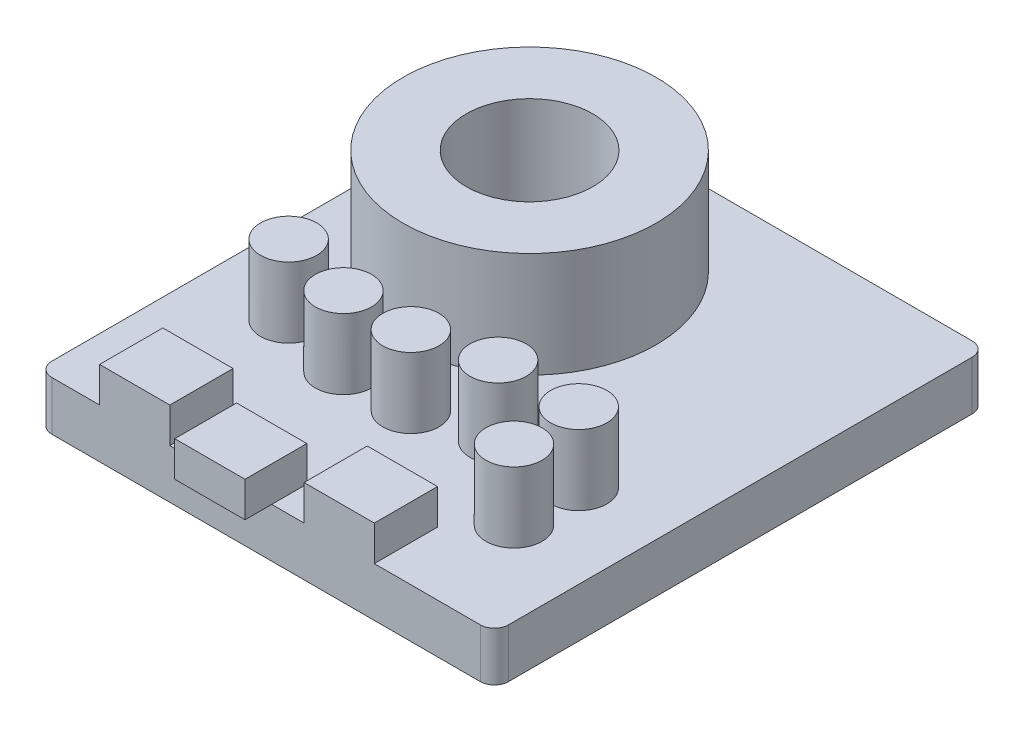
ISO-10303-21;
HEADER;
FILE_DESCRIPTION(('STEP AP214'),'2;1');
FILE_NAME('part.step','',(''),(''),'','','');
FILE_SCHEMA(('AUTOMOTIVE_DESIGN { 1 0 10303 214 1 1 1 1 }'));
ENDSEC;
DATA;
#1=APPLICATION_CONTEXT('core data for automotive mechanical design processes');
#2=APPLICATION_PROTOCOL_DEFINITION('international standard','automotive_design',2000,#1);
#3=PRODUCT_CONTEXT('',#1,'mechanical');
#4=PRODUCT('Part','Part','',(#3));
#5=PRODUCT_RELATED_PRODUCT_CATEGORY('part','',(#4));
#6=PRODUCT_DEFINITION_FORMATION('','',#4);
#7=PRODUCT_DEFINITION_CONTEXT('part definition',#1,'design');
#8=PRODUCT_DEFINITION('design','',#6,#7);
#9=PRODUCT_DEFINITION_SHAPE('','',#8);
#10=(LENGTH_UNIT() NAMED_UNIT(*) SI_UNIT(.MILLI.,.METRE.));
#11=(NAMED_UNIT(*) PLANE_ANGLE_UNIT() SI_UNIT($,.RADIAN.));
#12=(NAMED_UNIT(*) SI_UNIT($,.STERADIAN.) SOLID_ANGLE_UNIT());
#13=UNCERTAINTY_MEASURE_WITH_UNIT(LENGTH_MEASURE(1.E-05),#10,'distance_accuracy_value','');
#14=(GEOMETRIC_REPRESENTATION_CONTEXT(3) GLOBAL_UNCERTAINTY_ASSIGNED_CONTEXT((#13)) GLOBAL_UNIT_ASSIGNED_CONTEXT((#10,
#11,#12)) REPRESENTATION_CONTEXT('',''));
#15=CARTESIAN_POINT('',(0.,0.,0.));
#16=DIRECTION('',(0.,0.,1.));
#17=DIRECTION('',(1.,0.,0.));
#18=AXIS2_PLACEMENT_3D('',#15,#16,#17);
#19=CARTESIAN_POINT('',(0.,7.,0.));
#20=DIRECTION('',(0.,-1.,0.));
#21=DIRECTION('',(0.,0.,-1.));
#22=AXIS2_PLACEMENT_3D('',#19,#20,#21);
#23=PLANE('',#22);
#24=CARTESIAN_POINT('',(-9.5,7.,-12.));
#25=DIRECTION('',(0.,1.,0.));
#26=DIRECTION('',(0.,0.,1.));
#27=AXIS2_PLACEMENT_3D('',#24,#25,#26);
#28=CIRCLE('',#27,18.);
#29=CARTESIAN_POINT('',(-9.5,7.,5.99999999999999));
#30=VERTEX_POINT('',#29);
#31=EDGE_CURVE('E297',#30,#30,#28,.T.);
#32=ORIENTED_EDGE('',*,*,#31,.F.);
#33=EDGE_LOOP('',(#32));
#34=FACE_BOUND('',#33,.T.);
#35=CARTESIAN_POINT('',(-20.6937095825985,7.,11.0993533215755));
#36=DIRECTION('',(0.,-1.,0.));
#37=DIRECTION('',(0.,0.,-1.));
#38=AXIS2_PLACEMENT_3D('',#35,#36,#37);
#39=CIRCLE('',#38,4.);
#40=CARTESIAN_POINT('',(-20.6937095825985,7.,7.09935332157553));
#41=VERTEX_POINT('',#40);
#42=EDGE_CURVE('E300',#41,#41,#39,.F.);
#43=ORIENTED_EDGE('',*,*,#42,.F.);
#44=EDGE_LOOP('',(#43));
#45=FACE_BOUND('',#44,.T.);
#46=CARTESIAN_POINT('',(-10.4409171075838,7.,13.5449735449735));
#47=DIRECTION('',(0.,-1.,0.));
#48=DIRECTION('',(0.,0.,-1.));
#49=AXIS2_PLACEMENT_3D('',#46,#47,#48);
#50=CIRCLE('',#49,4.);
#51=CARTESIAN_POINT('',(-10.4409171075838,7.,9.54497354497352));
#52=VERTEX_POINT('',#51);
#53=EDGE_CURVE('E364',#52,#52,#50,.F.);
#54=ORIENTED_EDGE('',*,*,#53,.F.);
#55=EDGE_LOOP('',(#54));
#56=FACE_BOUND('',#55,.T.);
#57=CARTESIAN_POINT('',(9.12404467960022,7.,11.0993533215755));
#58=DIRECTION('',(0.,-1.,0.));
#59=DIRECTION('',(0.,0.,-1.));
#60=AXIS2_PLACEMENT_3D('',#57,#58,#59);
#61=CIRCLE('',#60,4.);
#62=CARTESIAN_POINT('',(9.12404467960022,7.,7.09935332157552));
#63=VERTEX_POINT('',#62);
#64=EDGE_CURVE('E367',#63,#63,#61,.F.);
#65=ORIENTED_EDGE('',*,*,#64,.F.);
#66=EDGE_LOOP('',(#65));
#67=FACE_BOUND('',#66,.T.);
#68=CARTESIAN_POINT('',(20.5996472663139,7.,20.3174603174603));
#69=DIRECTION('',(0.,-1.,0.));
#70=DIRECTION('',(0.,0.,-1.));
#71=AXIS2_PLACEMENT_3D('',#68,#69,#70);
#72=CIRCLE('',#71,4.);
#73=CARTESIAN_POINT('',(20.5996472663139,7.,16.3174603174603));
#74=VERTEX_POINT('',#73);
#75=EDGE_CURVE('E370',#74,#74,#72,.F.);
#76=ORIENTED_EDGE('',*,*,#75,.F.);
#77=EDGE_LOOP('',(#76));
#78=FACE_BOUND('',#77,.T.);
#79=CARTESIAN_POINT('',(-0.846560846560873,7.,13.5449735449735));
#80=DIRECTION('',(0.,-1.,0.));
#81=DIRECTION('',(0.,0.,-1.));
#82=AXIS2_PLACEMENT_3D('',#79,#80,#81);
#83=CIRCLE('',#82,4.);
#84=CARTESIAN_POINT('',(-0.846560846560873,7.,9.54497354497352));
#85=VERTEX_POINT('',#84);
#86=EDGE_CURVE('E44',#85,#85,#83,.F.);
#87=ORIENTED_EDGE('',*,*,#86,.F.);
#88=EDGE_LOOP('',(#87));
#89=FACE_BOUND('',#88,.T.);
#90=CARTESIAN_POINT('',(20.5996472663139,7.,11.0993533215755));
#91=DIRECTION('',(0.,-1.,0.));
#92=DIRECTION('',(0.,0.,-1.));
#93=AXIS2_PLACEMENT_3D('',#90,#91,#92);
#94=CIRCLE('',#93,4.);
#95=CARTESIAN_POINT('',(20.5996472663139,7.,7.09935332157553));
#96=VERTEX_POINT('',#95);
#97=EDGE_CURVE('E11',#96,#96,#94,.F.);
#98=ORIENTED_EDGE('',*,*,#97,.F.);
#99=EDGE_LOOP('',(#98));
#100=FACE_BOUND('',#99,.T.);
#101=DIRECTION('',(0.,0.,1.));
#102=VECTOR('',#101,1.);
#103=CARTESIAN_POINT('',(5.39999999999999,7.,35.));
#104=LINE('',#103,#102);
#105=CARTESIAN_POINT('',(5.39999999999999,7.,26.));
#106=VERTEX_POINT('',#105);
#107=CARTESIAN_POINT('',(5.39999999999999,7.,35.));
#108=VERTEX_POINT('',#107);
#109=EDGE_CURVE('E51',#106,#108,#104,.T.);
#110=ORIENTED_EDGE('',*,*,#109,.F.);
#111=DIRECTION('',(-1.,0.,0.));
#112=VECTOR('',#111,1.);
#113=CARTESIAN_POINT('',(5.39999999999999,7.,26.));
#114=LINE('',#113,#112);
#115=CARTESIAN_POINT('',(15.4,7.,26.));
#116=VERTEX_POINT('',#115);
#117=EDGE_CURVE('E55',#116,#106,#114,.T.);
#118=ORIENTED_EDGE('',*,*,#117,.F.);
#119=DIRECTION('',(0.,0.,-1.));
#120=VECTOR('',#119,1.);
#121=CARTESIAN_POINT('',(15.4,7.,35.));
#122=LINE('',#121,#120);
#123=CARTESIAN_POINT('',(15.4,7.,35.));
#124=VERTEX_POINT('',#123);
#125=EDGE_CURVE('E509',#124,#116,#122,.T.);
#126=ORIENTED_EDGE('',*,*,#125,.F.);
#127=DIRECTION('',(1.,0.,0.));
#128=VECTOR('',#127,1.);
#129=CARTESIAN_POINT('',(-32.5,7.,35.));
#130=LINE('',#129,#128);
#131=CARTESIAN_POINT('',(30.5,7.,35.));
#132=VERTEX_POINT('',#131);
#133=EDGE_CURVE('E312',#124,#132,#130,.T.);
#134=ORIENTED_EDGE('',*,*,#133,.T.);
#135=CARTESIAN_POINT('',(30.5,7.,33.));
#136=DIRECTION('',(0.,-1.,0.));
#137=DIRECTION('',(0.,0.,-1.));
#138=AXIS2_PLACEMENT_3D('',#135,#136,#137);
#139=CIRCLE('',#138,2.);
#140=CARTESIAN_POINT('',(32.5,7.,33.));
#141=VERTEX_POINT('',#140);
#142=EDGE_CURVE('E344',#132,#141,#139,.F.);
#143=ORIENTED_EDGE('',*,*,#142,.T.);
#144=DIRECTION('',(0.,0.,-1.));
#145=VECTOR('',#144,1.);
#146=CARTESIAN_POINT('',(32.5,7.,35.));
#147=LINE('',#146,#145);
#148=CARTESIAN_POINT('',(32.5,7.,-33.));
#149=VERTEX_POINT('',#148);
#150=EDGE_CURVE('E302',#141,#149,#147,.T.);
#151=ORIENTED_EDGE('',*,*,#150,.T.);
#152=CARTESIAN_POINT('',(30.5,7.,-33.));
#153=DIRECTION('',(0.,-1.,0.));
#154=DIRECTION('',(0.,0.,-1.));
#155=AXIS2_PLACEMENT_3D('',#152,#153,#154);
#156=CIRCLE('',#155,2.);
#157=CARTESIAN_POINT('',(30.5,7.,-35.));
#158=VERTEX_POINT('',#157);
#159=EDGE_CURVE('E348',#149,#158,#156,.F.);
#160=ORIENTED_EDGE('',*,*,#159,.T.);
#161=DIRECTION('',(-1.,0.,0.));
#162=VECTOR('',#161,1.);
#163=CARTESIAN_POINT('',(-32.5,7.,-35.));
#164=LINE('',#163,#162);
#165=CARTESIAN_POINT('',(-30.5,7.,-35.));
#166=VERTEX_POINT('',#165);
#167=EDGE_CURVE('E305',#158,#166,#164,.T.);
#168=ORIENTED_EDGE('',*,*,#167,.T.);
#169=CARTESIAN_POINT('',(-30.5,7.,-33.));
#170=DIRECTION('',(0.,-1.,0.));
#171=DIRECTION('',(0.,0.,-1.));
#172=AXIS2_PLACEMENT_3D('',#169,#170,#171);
#173=CIRCLE('',#172,2.);
#174=CARTESIAN_POINT('',(-32.5,7.,-33.));
#175=VERTEX_POINT('',#174);
#176=EDGE_CURVE('E350',#166,#175,#173,.F.);
#177=ORIENTED_EDGE('',*,*,#176,.T.);
#178=DIRECTION('',(0.,0.,1.));
#179=VECTOR('',#178,1.);
#180=CARTESIAN_POINT('',(-32.5,7.,35.));
#181=LINE('',#180,#179);
#182=CARTESIAN_POINT('',(-32.5,7.,33.));
#183=VERTEX_POINT('',#182);
#184=EDGE_CURVE('E309',#175,#183,#181,.T.);
#185=ORIENTED_EDGE('',*,*,#184,.T.);
#186=CARTESIAN_POINT('',(-30.5,7.,33.));
#187=DIRECTION('',(0.,-1.,0.));
#188=DIRECTION('',(0.,0.,-1.));
#189=AXIS2_PLACEMENT_3D('',#186,#187,#188);
#190=CIRCLE('',#189,2.);
#191=CARTESIAN_POINT('',(-30.5,7.,35.));
#192=VERTEX_POINT('',#191);
#193=EDGE_CURVE('E346',#183,#192,#190,.F.);
#194=ORIENTED_EDGE('',*,*,#193,.T.);
#195=CARTESIAN_POINT('',(-23.7,7.,35.));
#196=VERTEX_POINT('',#195);
#197=EDGE_CURVE('E313',#192,#196,#130,.T.);
#198=ORIENTED_EDGE('',*,*,#197,.T.);
#199=DIRECTION('',(0.,0.,1.));
#200=VECTOR('',#199,1.);
#201=CARTESIAN_POINT('',(-23.7,7.,35.));
#202=LINE('',#201,#200);
#203=CARTESIAN_POINT('',(-23.7,7.,26.));
#204=VERTEX_POINT('',#203);
#205=EDGE_CURVE('E239',#204,#196,#202,.T.);
#206=ORIENTED_EDGE('',*,*,#205,.F.);
#207=DIRECTION('',(-1.,0.,0.));
#208=VECTOR('',#207,1.);
#209=CARTESIAN_POINT('',(-23.7,7.,26.));
#210=LINE('',#209,#208);
#211=CARTESIAN_POINT('',(-13.7,7.,26.));
#212=VERTEX_POINT('',#211);
#213=EDGE_CURVE('E244',#212,#204,#210,.T.);
#214=ORIENTED_EDGE('',*,*,#213,.F.);
#215=DIRECTION('',(0.,0.,-1.));
#216=VECTOR('',#215,1.);
#217=CARTESIAN_POINT('',(-13.7,7.,35.));
#218=LINE('',#217,#216);
#219=CARTESIAN_POINT('',(-13.7,7.,35.));
#220=VERTEX_POINT('',#219);
#221=EDGE_CURVE('E253',#220,#212,#218,.T.);
#222=ORIENTED_EDGE('',*,*,#221,.F.);
#223=CARTESIAN_POINT('',(-9.20000000000001,7.,35.));
#224=VERTEX_POINT('',#223);
#225=EDGE_CURVE('E316',#220,#224,#130,.T.);
#226=ORIENTED_EDGE('',*,*,#225,.T.);
#227=DIRECTION('',(0.,0.,1.));
#228=VECTOR('',#227,1.);
#229=CARTESIAN_POINT('',(-9.20000000000001,7.,38.8));
#230=LINE('',#229,#228);
#231=CARTESIAN_POINT('',(-9.20000000000001,7.,30.));
#232=VERTEX_POINT('',#231);
#233=EDGE_CURVE('E202',#232,#224,#230,.T.);
#234=ORIENTED_EDGE('',*,*,#233,.F.);
#235=DIRECTION('',(-1.,0.,0.));
#236=VECTOR('',#235,1.);
#237=CARTESIAN_POINT('',(-9.20000000000001,7.,30.));
#238=LINE('',#237,#236);
#239=CARTESIAN_POINT('',(0.799999999999986,7.,30.));
#240=VERTEX_POINT('',#239);
#241=EDGE_CURVE('E212',#240,#232,#238,.T.);
#242=ORIENTED_EDGE('',*,*,#241,.F.);
#243=DIRECTION('',(0.,0.,-1.));
#244=VECTOR('',#243,1.);
#245=CARTESIAN_POINT('',(0.799999999999986,7.,38.8));
#246=LINE('',#245,#244);
#247=CARTESIAN_POINT('',(0.799999999999986,7.,35.));
#248=VERTEX_POINT('',#247);
#249=EDGE_CURVE('E222',#248,#240,#246,.T.);
#250=ORIENTED_EDGE('',*,*,#249,.F.);
#251=EDGE_CURVE('E503',#248,#108,#130,.T.);
#252=ORIENTED_EDGE('',*,*,#251,.T.);
#253=EDGE_LOOP('',(#110,#118,#126,#134,#143,#151,#160,#168,#177,#185,#194,#198,#206,#214,#222,
#226,#234,#242,#250,#252));
#254=FACE_BOUND('',#253,.T.);
#255=ADVANCED_FACE('F36',(#34,#45,#56,#67,#78,#89,#100,#254),#23,.F.);
#256=CARTESIAN_POINT('',(32.5,7.,35.));
#257=DIRECTION('',(-1.,0.,0.));
#258=DIRECTION('',(0.,0.,1.));
#259=AXIS2_PLACEMENT_3D('',#256,#257,#258);
#260=PLANE('',#259);
#261=DIRECTION('',(0.,0.,-1.));
#262=VECTOR('',#261,1.);
#263=CARTESIAN_POINT('',(32.5,0.,35.));
#264=LINE('',#263,#262);
#265=CARTESIAN_POINT('',(32.5,0.,33.));
#266=VERTEX_POINT('',#265);
#267=CARTESIAN_POINT('',(32.5,0.,-33.));
#268=VERTEX_POINT('',#267);
#269=EDGE_CURVE('E296',#266,#268,#264,.T.);
#270=ORIENTED_EDGE('',*,*,#269,.T.);
#271=DIRECTION('',(0.,-1.,0.));
#272=VECTOR('',#271,1.);
#273=CARTESIAN_POINT('',(32.5,7.,-33.));
#274=LINE('',#273,#272);
#275=EDGE_CURVE('E355',#268,#149,#274,.F.);
#276=ORIENTED_EDGE('',*,*,#275,.T.);
#277=ORIENTED_EDGE('',*,*,#150,.F.);
#278=DIRECTION('',(0.,-1.,0.));
#279=VECTOR('',#278,1.);
#280=CARTESIAN_POINT('',(32.5,7.,33.));
#281=LINE('',#280,#279);
#282=EDGE_CURVE('E352',#141,#266,#281,.T.);
#283=ORIENTED_EDGE('',*,*,#282,.T.);
#284=EDGE_LOOP('',(#270,#276,#277,#283));
#285=FACE_BOUND('',#284,.T.);
#286=ADVANCED_FACE('F379',(#285),#260,.F.);
#287=CARTESIAN_POINT('',(-32.5,7.,-35.));
#288=DIRECTION('',(0.,0.,1.));
#289=DIRECTION('',(1.,0.,0.));
#290=AXIS2_PLACEMENT_3D('',#287,#288,#289);
#291=PLANE('',#290);
#292=DIRECTION('',(-1.,0.,0.));
#293=VECTOR('',#292,1.);
#294=CARTESIAN_POINT('',(-32.5,0.,-35.));
#295=LINE('',#294,#293);
#296=CARTESIAN_POINT('',(30.5,0.,-35.));
#297=VERTEX_POINT('',#296);
#298=CARTESIAN_POINT('',(-30.5,0.,-35.));
#299=VERTEX_POINT('',#298);
#300=EDGE_CURVE('E319',#297,#299,#295,.T.);
#301=ORIENTED_EDGE('',*,*,#300,.T.);
#302=DIRECTION('',(0.,-1.,0.));
#303=VECTOR('',#302,1.);
#304=CARTESIAN_POINT('',(-30.5,7.,-35.));
#305=LINE('',#304,#303);
#306=EDGE_CURVE('E342',#299,#166,#305,.F.);
#307=ORIENTED_EDGE('',*,*,#306,.T.);
#308=ORIENTED_EDGE('',*,*,#167,.F.);
#309=DIRECTION('',(0.,-1.,0.));
#310=VECTOR('',#309,1.);
#311=CARTESIAN_POINT('',(30.5,7.,-35.));
#312=LINE('',#311,#310);
#313=EDGE_CURVE('E339',#158,#297,#312,.T.);
#314=ORIENTED_EDGE('',*,*,#313,.T.);
#315=EDGE_LOOP('',(#301,#307,#308,#314));
#316=FACE_BOUND('',#315,.T.);
#317=ADVANCED_FACE('F460',(#316),#291,.F.);
#318=CARTESIAN_POINT('',(-32.5,7.,35.));
#319=DIRECTION('',(1.,0.,0.));
#320=DIRECTION('',(0.,0.,-1.));
#321=AXIS2_PLACEMENT_3D('',#318,#319,#320);
#322=PLANE('',#321);
#323=ORIENTED_EDGE('',*,*,#184,.F.);
#324=DIRECTION('',(0.,-1.,0.));
#325=VECTOR('',#324,1.);
#326=CARTESIAN_POINT('',(-32.5,7.,-33.));
#327=LINE('',#326,#325);
#328=CARTESIAN_POINT('',(-32.5,0.,-33.));
#329=VERTEX_POINT('',#328);
#330=EDGE_CURVE('E328',#175,#329,#327,.T.);
#331=ORIENTED_EDGE('',*,*,#330,.T.);
#332=DIRECTION('',(0.,0.,1.));
#333=VECTOR('',#332,1.);
#334=CARTESIAN_POINT('',(-32.5,0.,35.));
#335=LINE('',#334,#333);
#336=CARTESIAN_POINT('',(-32.5,0.,33.));
#337=VERTEX_POINT('',#336);
#338=EDGE_CURVE('E322',#329,#337,#335,.T.);
#339=ORIENTED_EDGE('',*,*,#338,.T.);
#340=DIRECTION('',(0.,-1.,0.));
#341=VECTOR('',#340,1.);
#342=CARTESIAN_POINT('',(-32.5,7.,33.));
#343=LINE('',#342,#341);
#344=EDGE_CURVE('E315',#337,#183,#343,.F.);
#345=ORIENTED_EDGE('',*,*,#344,.T.);
#346=EDGE_LOOP('',(#323,#331,#339,#345));
#347=FACE_BOUND('',#346,.T.);
#348=ADVANCED_FACE('F457',(#347),#322,.F.);
#349=CARTESIAN_POINT('',(-32.5,7.,35.));
#350=DIRECTION('',(0.,0.,-1.));
#351=DIRECTION('',(-1.,0.,0.));
#352=AXIS2_PLACEMENT_3D('',#349,#350,#351);
#353=PLANE('',#352);
#354=ORIENTED_EDGE('',*,*,#197,.F.);
#355=DIRECTION('',(0.,-1.,0.));
#356=VECTOR('',#355,1.);
#357=CARTESIAN_POINT('',(-30.5,7.,35.));
#358=LINE('',#357,#356);
#359=CARTESIAN_POINT('',(-30.5,0.,35.));
#360=VERTEX_POINT('',#359);
#361=EDGE_CURVE('E301',#192,#360,#358,.T.);
#362=ORIENTED_EDGE('',*,*,#361,.T.);
#363=DIRECTION('',(1.,0.,0.));
#364=VECTOR('',#363,1.);
#365=CARTESIAN_POINT('',(-32.5,0.,35.));
#366=LINE('',#365,#364);
#367=CARTESIAN_POINT('',(30.5,0.,35.));
#368=VERTEX_POINT('',#367);
#369=EDGE_CURVE('E306',#360,#368,#366,.T.);
#370=ORIENTED_EDGE('',*,*,#369,.T.);
#371=DIRECTION('',(0.,-1.,0.));
#372=VECTOR('',#371,1.);
#373=CARTESIAN_POINT('',(30.5,7.,35.));
#374=LINE('',#373,#372);
#375=EDGE_CURVE('E357',#368,#132,#374,.F.);
#376=ORIENTED_EDGE('',*,*,#375,.T.);
#377=ORIENTED_EDGE('',*,*,#133,.F.);
#378=DIRECTION('',(0.,-1.,0.));
#379=VECTOR('',#378,1.);
#380=CARTESIAN_POINT('',(15.4,12.,35.));
#381=LINE('',#380,#379);
#382=CARTESIAN_POINT('',(15.4,12.,35.));
#383=VERTEX_POINT('',#382);
#384=EDGE_CURVE('E185',#383,#124,#381,.T.);
#385=ORIENTED_EDGE('',*,*,#384,.F.);
#386=DIRECTION('',(1.,0.,0.));
#387=VECTOR('',#386,1.);
#388=CARTESIAN_POINT('',(5.39999999999999,12.,35.));
#389=LINE('',#388,#387);
#390=CARTESIAN_POINT('',(5.39999999999999,12.,35.));
#391=VERTEX_POINT('',#390);
#392=EDGE_CURVE('E178',#391,#383,#389,.T.);
#393=ORIENTED_EDGE('',*,*,#392,.F.);
#394=DIRECTION('',(0.,-1.,0.));
#395=VECTOR('',#394,1.);
#396=CARTESIAN_POINT('',(5.39999999999999,12.,35.));
#397=LINE('',#396,#395);
#398=EDGE_CURVE('E183',#391,#108,#397,.T.);
#399=ORIENTED_EDGE('',*,*,#398,.T.);
#400=ORIENTED_EDGE('',*,*,#251,.F.);
#401=EDGE_CURVE('E502',#224,#248,#130,.T.);
#402=ORIENTED_EDGE('',*,*,#401,.F.);
#403=ORIENTED_EDGE('',*,*,#225,.F.);
#404=DIRECTION('',(0.,-1.,0.));
#405=VECTOR('',#404,1.);
#406=CARTESIAN_POINT('',(-13.7,12.,35.));
#407=LINE('',#406,#405);
#408=CARTESIAN_POINT('',(-13.7,12.,35.));
#409=VERTEX_POINT('',#408);
#410=EDGE_CURVE('E263',#409,#220,#407,.T.);
#411=ORIENTED_EDGE('',*,*,#410,.F.);
#412=DIRECTION('',(1.,0.,0.));
#413=VECTOR('',#412,1.);
#414=CARTESIAN_POINT('',(-23.7,12.,35.));
#415=LINE('',#414,#413);
#416=CARTESIAN_POINT('',(-23.7,12.,35.));
#417=VERTEX_POINT('',#416);
#418=EDGE_CURVE('E243',#417,#409,#415,.T.);
#419=ORIENTED_EDGE('',*,*,#418,.F.);
#420=DIRECTION('',(0.,-1.,0.));
#421=VECTOR('',#420,1.);
#422=CARTESIAN_POINT('',(-23.7,12.,35.));
#423=LINE('',#422,#421);
#424=EDGE_CURVE('E266',#417,#196,#423,.T.);
#425=ORIENTED_EDGE('',*,*,#424,.T.);
#426=EDGE_LOOP('',(#354,#362,#370,#376,#377,#385,#393,#399,#400,#402,#403,#411,#419,#425));
#427=FACE_BOUND('',#426,.T.);
#428=ADVANCED_FACE('F181',(#427),#353,.F.);
#429=CARTESIAN_POINT('',(0.,0.,0.));
#430=DIRECTION('',(0.,-1.,0.));
#431=DIRECTION('',(0.,0.,-1.));
#432=AXIS2_PLACEMENT_3D('',#429,#430,#431);
#433=PLANE('',#432);
#434=ORIENTED_EDGE('',*,*,#338,.F.);
#435=CARTESIAN_POINT('',(-30.5,0.,-33.));
#436=DIRECTION('',(0.,-1.,0.));
#437=DIRECTION('',(0.,0.,-1.));
#438=AXIS2_PLACEMENT_3D('',#435,#436,#437);
#439=CIRCLE('',#438,2.);
#440=EDGE_CURVE('E337',#329,#299,#439,.T.);
#441=ORIENTED_EDGE('',*,*,#440,.T.);
#442=ORIENTED_EDGE('',*,*,#300,.F.);
#443=CARTESIAN_POINT('',(30.5,0.,-33.));
#444=DIRECTION('',(0.,-1.,0.));
#445=DIRECTION('',(0.,0.,-1.));
#446=AXIS2_PLACEMENT_3D('',#443,#444,#445);
#447=CIRCLE('',#446,2.);
#448=EDGE_CURVE('E335',#297,#268,#447,.T.);
#449=ORIENTED_EDGE('',*,*,#448,.T.);
#450=ORIENTED_EDGE('',*,*,#269,.F.);
#451=CARTESIAN_POINT('',(30.5,0.,33.));
#452=DIRECTION('',(0.,-1.,0.));
#453=DIRECTION('',(0.,0.,-1.));
#454=AXIS2_PLACEMENT_3D('',#451,#452,#453);
#455=CIRCLE('',#454,2.);
#456=EDGE_CURVE('E331',#266,#368,#455,.T.);
#457=ORIENTED_EDGE('',*,*,#456,.T.);
#458=ORIENTED_EDGE('',*,*,#369,.F.);
#459=CARTESIAN_POINT('',(-30.5,0.,33.));
#460=DIRECTION('',(0.,-1.,0.));
#461=DIRECTION('',(0.,0.,-1.));
#462=AXIS2_PLACEMENT_3D('',#459,#460,#461);
#463=CIRCLE('',#462,2.);
#464=EDGE_CURVE('E333',#360,#337,#463,.T.);
#465=ORIENTED_EDGE('',*,*,#464,.T.);
#466=EDGE_LOOP('',(#434,#441,#442,#449,#450,#457,#458,#465));
#467=FACE_BOUND('',#466,.T.);
#468=ADVANCED_FACE('F450',(#467),#433,.T.);
#469=CARTESIAN_POINT('',(-30.5,7.,-33.));
#470=DIRECTION('',(0.,-1.,0.));
#471=DIRECTION('',(0.,0.,-1.));
#472=AXIS2_PLACEMENT_3D('',#469,#470,#471);
#473=CYLINDRICAL_SURFACE('',#472,2.);
#474=ORIENTED_EDGE('',*,*,#176,.F.);
#475=ORIENTED_EDGE('',*,*,#306,.F.);
#476=ORIENTED_EDGE('',*,*,#440,.F.);
#477=ORIENTED_EDGE('',*,*,#330,.F.);
#478=EDGE_LOOP('',(#474,#475,#476,#477));
#479=FACE_BOUND('',#478,.T.);
#480=ADVANCED_FACE('F453',(#479),#473,.T.);
#481=CARTESIAN_POINT('',(30.5,7.,-33.));
#482=DIRECTION('',(0.,-1.,0.));
#483=DIRECTION('',(0.,0.,-1.));
#484=AXIS2_PLACEMENT_3D('',#481,#482,#483);
#485=CYLINDRICAL_SURFACE('',#484,2.);
#486=ORIENTED_EDGE('',*,*,#159,.F.);
#487=ORIENTED_EDGE('',*,*,#275,.F.);
#488=ORIENTED_EDGE('',*,*,#448,.F.);
#489=ORIENTED_EDGE('',*,*,#313,.F.);
#490=EDGE_LOOP('',(#486,#487,#488,#489));
#491=FACE_BOUND('',#490,.T.);
#492=ADVANCED_FACE('F470',(#491),#485,.T.);
#493=CARTESIAN_POINT('',(-30.5,7.,33.));
#494=DIRECTION('',(0.,-1.,0.));
#495=DIRECTION('',(0.,0.,-1.));
#496=AXIS2_PLACEMENT_3D('',#493,#494,#495);
#497=CYLINDRICAL_SURFACE('',#496,2.);
#498=ORIENTED_EDGE('',*,*,#193,.F.);
#499=ORIENTED_EDGE('',*,*,#344,.F.);
#500=ORIENTED_EDGE('',*,*,#464,.F.);
#501=ORIENTED_EDGE('',*,*,#361,.F.);
#502=EDGE_LOOP('',(#498,#499,#500,#501));
#503=FACE_BOUND('',#502,.T.);
#504=ADVANCED_FACE('F473',(#503),#497,.T.);
#505=CARTESIAN_POINT('',(30.5,7.,33.));
#506=DIRECTION('',(0.,-1.,0.));
#507=DIRECTION('',(0.,0.,-1.));
#508=AXIS2_PLACEMENT_3D('',#505,#506,#507);
#509=CYLINDRICAL_SURFACE('',#508,2.);
#510=ORIENTED_EDGE('',*,*,#142,.F.);
#511=ORIENTED_EDGE('',*,*,#375,.F.);
#512=ORIENTED_EDGE('',*,*,#456,.F.);
#513=ORIENTED_EDGE('',*,*,#282,.F.);
#514=EDGE_LOOP('',(#510,#511,#512,#513));
#515=FACE_BOUND('',#514,.T.);
#516=ADVANCED_FACE('F38',(#515),#509,.T.);
#517=CARTESIAN_POINT('',(-9.5,22.,-12.));
#518=DIRECTION('',(0.,1.,0.));
#519=DIRECTION('',(0.,0.,1.));
#520=AXIS2_PLACEMENT_3D('',#517,#518,#519);
#521=PLANE('',#520);
#522=CARTESIAN_POINT('',(-9.5,22.,-12.));
#523=DIRECTION('',(0.,1.,0.));
#524=DIRECTION('',(0.,0.,1.));
#525=AXIS2_PLACEMENT_3D('',#522,#523,#524);
#526=CIRCLE('',#525,18.);
#527=CARTESIAN_POINT('',(-9.5,22.,5.99999999999999));
#528=VERTEX_POINT('',#527);
#529=EDGE_CURVE('E291',#528,#528,#526,.T.);
#530=ORIENTED_EDGE('',*,*,#529,.T.);
#531=EDGE_LOOP('',(#530));
#532=FACE_BOUND('',#531,.T.);
#533=CARTESIAN_POINT('',(-9.5,22.,-12.));
#534=DIRECTION('',(0.,1.,0.));
#535=DIRECTION('',(0.,0.,1.));
#536=AXIS2_PLACEMENT_3D('',#533,#534,#535);
#537=CIRCLE('',#536,9.);
#538=CARTESIAN_POINT('',(-9.5,22.,-3.));
#539=VERTEX_POINT('',#538);
#540=EDGE_CURVE('E288',#539,#539,#537,.T.);
#541=ORIENTED_EDGE('',*,*,#540,.F.);
#542=EDGE_LOOP('',(#541));
#543=FACE_BOUND('',#542,.T.);
#544=ADVANCED_FACE('F443',(#532,#543),#521,.T.);
#545=CARTESIAN_POINT('',(-9.5,22.,-12.));
#546=DIRECTION('',(0.,-1.,0.));
#547=DIRECTION('',(0.,0.,-1.));
#548=AXIS2_PLACEMENT_3D('',#545,#546,#547);
#549=CYLINDRICAL_SURFACE('',#548,18.);
#550=ORIENTED_EDGE('',*,*,#529,.F.);
#551=EDGE_LOOP('',(#550));
#552=FACE_BOUND('',#551,.T.);
#553=ORIENTED_EDGE('',*,*,#31,.T.);
#554=EDGE_LOOP('',(#553));
#555=FACE_BOUND('',#554,.T.);
#556=ADVANCED_FACE('F441',(#552,#555),#549,.T.);
#557=CARTESIAN_POINT('',(-9.5,22.,-12.));
#558=DIRECTION('',(0.,-1.,0.));
#559=DIRECTION('',(0.,0.,-1.));
#560=AXIS2_PLACEMENT_3D('',#557,#558,#559);
#561=CYLINDRICAL_SURFACE('',#560,9.);
#562=ORIENTED_EDGE('',*,*,#540,.T.);
#563=EDGE_LOOP('',(#562));
#564=FACE_BOUND('',#563,.T.);
#565=CARTESIAN_POINT('',(-9.5,7.,-12.));
#566=DIRECTION('',(0.,1.,0.));
#567=DIRECTION('',(0.,0.,1.));
#568=AXIS2_PLACEMENT_3D('',#565,#566,#567);
#569=CIRCLE('',#568,9.);
#570=CARTESIAN_POINT('',(-9.5,7.,-3.));
#571=VERTEX_POINT('',#570);
#572=EDGE_CURVE('E287',#571,#571,#569,.T.);
#573=ORIENTED_EDGE('',*,*,#572,.F.);
#574=EDGE_LOOP('',(#573));
#575=FACE_BOUND('',#574,.T.);
#576=ADVANCED_FACE('F438',(#564,#575),#561,.F.);
#577=ORIENTED_EDGE('',*,*,#572,.T.);
#578=EDGE_LOOP('',(#577));
#579=FACE_BOUND('',#578,.T.);
#580=ADVANCED_FACE('F382',(#579),#23,.F.);
#581=CARTESIAN_POINT('',(-20.6937095825985,17.,11.0993533215755));
#582=DIRECTION('',(0.,-1.,0.));
#583=DIRECTION('',(0.,0.,-1.));
#584=AXIS2_PLACEMENT_3D('',#581,#582,#583);
#585=CYLINDRICAL_SURFACE('',#584,4.);
#586=CARTESIAN_POINT('',(-20.6937095825985,17.,11.0993533215755));
#587=DIRECTION('',(0.,1.,0.));
#588=DIRECTION('',(0.,0.,1.));
#589=AXIS2_PLACEMENT_3D('',#586,#587,#588);
#590=CIRCLE('',#589,4.);
#591=CARTESIAN_POINT('',(-20.6937095825985,17.,15.0993533215755));
#592=VERTEX_POINT('',#591);
#593=EDGE_CURVE('E284',#592,#592,#590,.T.);
#594=ORIENTED_EDGE('',*,*,#593,.F.);
#595=EDGE_LOOP('',(#594));
#596=FACE_BOUND('',#595,.T.);
#597=ORIENTED_EDGE('',*,*,#42,.T.);
#598=EDGE_LOOP('',(#597));
#599=FACE_BOUND('',#598,.T.);
#600=ADVANCED_FACE('F433',(#596,#599),#585,.T.);
#601=CARTESIAN_POINT('',(-20.6937095825985,17.,11.0993533215755));
#602=DIRECTION('',(0.,1.,0.));
#603=DIRECTION('',(0.,0.,1.));
#604=AXIS2_PLACEMENT_3D('',#601,#602,#603);
#605=PLANE('',#604);
#606=ORIENTED_EDGE('',*,*,#593,.T.);
#607=EDGE_LOOP('',(#606));
#608=FACE_BOUND('',#607,.T.);
#609=ADVANCED_FACE('F429',(#608),#605,.T.);
#610=CARTESIAN_POINT('',(-10.4409171075838,17.,13.5449735449735));
#611=DIRECTION('',(0.,-1.,0.));
#612=DIRECTION('',(0.,0.,-1.));
#613=AXIS2_PLACEMENT_3D('',#610,#611,#612);
#614=CYLINDRICAL_SURFACE('',#613,4.);
#615=CARTESIAN_POINT('',(-10.4409171075838,17.,13.5449735449735));
#616=DIRECTION('',(0.,1.,0.));
#617=DIRECTION('',(0.,0.,1.));
#618=AXIS2_PLACEMENT_3D('',#615,#616,#617);
#619=CIRCLE('',#618,4.);
#620=CARTESIAN_POINT('',(-10.4409171075838,17.,17.5449735449735));
#621=VERTEX_POINT('',#620);
#622=EDGE_CURVE('E281',#621,#621,#619,.T.);
#623=ORIENTED_EDGE('',*,*,#622,.F.);
#624=EDGE_LOOP('',(#623));
#625=FACE_BOUND('',#624,.T.);
#626=ORIENTED_EDGE('',*,*,#53,.T.);
#627=EDGE_LOOP('',(#626));
#628=FACE_BOUND('',#627,.T.);
#629=ADVANCED_FACE('F425',(#625,#628),#614,.T.);
#630=CARTESIAN_POINT('',(-10.4409171075838,17.,13.5449735449735));
#631=DIRECTION('',(0.,1.,0.));
#632=DIRECTION('',(0.,0.,1.));
#633=AXIS2_PLACEMENT_3D('',#630,#631,#632);
#634=PLANE('',#633);
#635=ORIENTED_EDGE('',*,*,#622,.T.);
#636=EDGE_LOOP('',(#635));
#637=FACE_BOUND('',#636,.T.);
#638=ADVANCED_FACE('F421',(#637),#634,.T.);
#639=CARTESIAN_POINT('',(9.12404467960022,17.,11.0993533215755));
#640=DIRECTION('',(0.,-1.,0.));
#641=DIRECTION('',(0.,0.,-1.));
#642=AXIS2_PLACEMENT_3D('',#639,#640,#641);
#643=CYLINDRICAL_SURFACE('',#642,4.);
#644=CARTESIAN_POINT('',(9.12404467960022,17.,11.0993533215755));
#645=DIRECTION('',(0.,1.,0.));
#646=DIRECTION('',(0.,0.,1.));
#647=AXIS2_PLACEMENT_3D('',#644,#645,#646);
#648=CIRCLE('',#647,4.);
#649=CARTESIAN_POINT('',(9.12404467960022,17.,15.0993533215755));
#650=VERTEX_POINT('',#649);
#651=EDGE_CURVE('E278',#650,#650,#648,.T.);
#652=ORIENTED_EDGE('',*,*,#651,.F.);
#653=EDGE_LOOP('',(#652));
#654=FACE_BOUND('',#653,.T.);
#655=ORIENTED_EDGE('',*,*,#64,.T.);
#656=EDGE_LOOP('',(#655));
#657=FACE_BOUND('',#656,.T.);
#658=ADVANCED_FACE('F417',(#654,#657),#643,.T.);
#659=CARTESIAN_POINT('',(9.12404467960022,17.,11.0993533215755));
#660=DIRECTION('',(0.,1.,0.));
#661=DIRECTION('',(0.,0.,1.));
#662=AXIS2_PLACEMENT_3D('',#659,#660,#661);
#663=PLANE('',#662);
#664=ORIENTED_EDGE('',*,*,#651,.T.);
#665=EDGE_LOOP('',(#664));
#666=FACE_BOUND('',#665,.T.);
#667=ADVANCED_FACE('F413',(#666),#663,.T.);
#668=CARTESIAN_POINT('',(20.5996472663139,17.,20.3174603174603));
#669=DIRECTION('',(0.,-1.,0.));
#670=DIRECTION('',(0.,0.,-1.));
#671=AXIS2_PLACEMENT_3D('',#668,#669,#670);
#672=CYLINDRICAL_SURFACE('',#671,4.);
#673=CARTESIAN_POINT('',(20.5996472663139,17.,20.3174603174603));
#674=DIRECTION('',(0.,1.,0.));
#675=DIRECTION('',(0.,0.,1.));
#676=AXIS2_PLACEMENT_3D('',#673,#674,#675);
#677=CIRCLE('',#676,4.);
#678=CARTESIAN_POINT('',(20.5996472663139,17.,24.3174603174603));
#679=VERTEX_POINT('',#678);
#680=EDGE_CURVE('E275',#679,#679,#677,.T.);
#681=ORIENTED_EDGE('',*,*,#680,.F.);
#682=EDGE_LOOP('',(#681));
#683=FACE_BOUND('',#682,.T.);
#684=ORIENTED_EDGE('',*,*,#75,.T.);
#685=EDGE_LOOP('',(#684));
#686=FACE_BOUND('',#685,.T.);
#687=ADVANCED_FACE('F409',(#683,#686),#672,.T.);
#688=CARTESIAN_POINT('',(20.5996472663139,17.,20.3174603174603));
#689=DIRECTION('',(0.,1.,0.));
#690=DIRECTION('',(0.,0.,1.));
#691=AXIS2_PLACEMENT_3D('',#688,#689,#690);
#692=PLANE('',#691);
#693=ORIENTED_EDGE('',*,*,#680,.T.);
#694=EDGE_LOOP('',(#693));
#695=FACE_BOUND('',#694,.T.);
#696=ADVANCED_FACE('F405',(#695),#692,.T.);
#697=CARTESIAN_POINT('',(-0.846560846560873,17.,13.5449735449735));
#698=DIRECTION('',(0.,-1.,0.));
#699=DIRECTION('',(0.,0.,-1.));
#700=AXIS2_PLACEMENT_3D('',#697,#698,#699);
#701=CYLINDRICAL_SURFACE('',#700,4.);
#702=CARTESIAN_POINT('',(-0.846560846560873,17.,13.5449735449735));
#703=DIRECTION('',(0.,1.,0.));
#704=DIRECTION('',(0.,0.,1.));
#705=AXIS2_PLACEMENT_3D('',#702,#703,#704);
#706=CIRCLE('',#705,4.);
#707=CARTESIAN_POINT('',(-0.846560846560873,17.,17.5449735449735));
#708=VERTEX_POINT('',#707);
#709=EDGE_CURVE('E272',#708,#708,#706,.T.);
#710=ORIENTED_EDGE('',*,*,#709,.F.);
#711=EDGE_LOOP('',(#710));
#712=FACE_BOUND('',#711,.T.);
#713=ORIENTED_EDGE('',*,*,#86,.T.);
#714=EDGE_LOOP('',(#713));
#715=FACE_BOUND('',#714,.T.);
#716=ADVANCED_FACE('F375',(#712,#715),#701,.T.);
#717=CARTESIAN_POINT('',(-0.846560846560873,17.,13.5449735449735));
#718=DIRECTION('',(0.,1.,0.));
#719=DIRECTION('',(0.,0.,1.));
#720=AXIS2_PLACEMENT_3D('',#717,#718,#719);
#721=PLANE('',#720);
#722=ORIENTED_EDGE('',*,*,#709,.T.);
#723=EDGE_LOOP('',(#722));
#724=FACE_BOUND('',#723,.T.);
#725=ADVANCED_FACE('F388',(#724),#721,.T.);
#726=CARTESIAN_POINT('',(20.5996472663139,17.,11.0993533215755));
#727=DIRECTION('',(0.,-1.,0.));
#728=DIRECTION('',(0.,0.,-1.));
#729=AXIS2_PLACEMENT_3D('',#726,#727,#728);
#730=CYLINDRICAL_SURFACE('',#729,4.);
#731=CARTESIAN_POINT('',(20.5996472663139,17.,11.0993533215755));
#732=DIRECTION('',(0.,1.,0.));
#733=DIRECTION('',(0.,0.,1.));
#734=AXIS2_PLACEMENT_3D('',#731,#732,#733);
#735=CIRCLE('',#734,4.);
#736=CARTESIAN_POINT('',(20.5996472663139,17.,15.0993533215755));
#737=VERTEX_POINT('',#736);
#738=EDGE_CURVE('E269',#737,#737,#735,.T.);
#739=ORIENTED_EDGE('',*,*,#738,.F.);
#740=EDGE_LOOP('',(#739));
#741=FACE_BOUND('',#740,.T.);
#742=ORIENTED_EDGE('',*,*,#97,.T.);
#743=EDGE_LOOP('',(#742));
#744=FACE_BOUND('',#743,.T.);
#745=ADVANCED_FACE('F385',(#741,#744),#730,.T.);
#746=CARTESIAN_POINT('',(20.5996472663139,17.,11.0993533215755));
#747=DIRECTION('',(0.,1.,0.));
#748=DIRECTION('',(0.,0.,1.));
#749=AXIS2_PLACEMENT_3D('',#746,#747,#748);
#750=PLANE('',#749);
#751=ORIENTED_EDGE('',*,*,#738,.T.);
#752=EDGE_LOOP('',(#751));
#753=FACE_BOUND('',#752,.T.);
#754=ADVANCED_FACE('F387',(#753),#750,.T.);
#755=CARTESIAN_POINT('',(-23.7,12.,35.));
#756=DIRECTION('',(1.,0.,0.));
#757=DIRECTION('',(0.,0.,-1.));
#758=AXIS2_PLACEMENT_3D('',#755,#756,#757);
#759=PLANE('',#758);
#760=ORIENTED_EDGE('',*,*,#205,.T.);
#761=ORIENTED_EDGE('',*,*,#424,.F.);
#762=DIRECTION('',(0.,0.,1.));
#763=VECTOR('',#762,1.);
#764=CARTESIAN_POINT('',(-23.7,12.,35.));
#765=LINE('',#764,#763);
#766=CARTESIAN_POINT('',(-23.7,12.,26.));
#767=VERTEX_POINT('',#766);
#768=EDGE_CURVE('E240',#767,#417,#765,.T.);
#769=ORIENTED_EDGE('',*,*,#768,.F.);
#770=DIRECTION('',(0.,-1.,0.));
#771=VECTOR('',#770,1.);
#772=CARTESIAN_POINT('',(-23.7,12.,26.));
#773=LINE('',#772,#771);
#774=EDGE_CURVE('E250',#767,#204,#773,.T.);
#775=ORIENTED_EDGE('',*,*,#774,.T.);
#776=EDGE_LOOP('',(#760,#761,#769,#775));
#777=FACE_BOUND('',#776,.T.);
#778=ADVANCED_FACE('F395',(#777),#759,.F.);
#779=CARTESIAN_POINT('',(-13.7,12.,35.));
#780=DIRECTION('',(-1.,0.,0.));
#781=DIRECTION('',(0.,0.,1.));
#782=AXIS2_PLACEMENT_3D('',#779,#780,#781);
#783=PLANE('',#782);
#784=ORIENTED_EDGE('',*,*,#221,.T.);
#785=DIRECTION('',(0.,-1.,0.));
#786=VECTOR('',#785,1.);
#787=CARTESIAN_POINT('',(-13.7,12.,26.));
#788=LINE('',#787,#786);
#789=CARTESIAN_POINT('',(-13.7,12.,26.));
#790=VERTEX_POINT('',#789);
#791=EDGE_CURVE('E260',#790,#212,#788,.T.);
#792=ORIENTED_EDGE('',*,*,#791,.F.);
#793=DIRECTION('',(0.,0.,-1.));
#794=VECTOR('',#793,1.);
#795=CARTESIAN_POINT('',(-13.7,12.,35.));
#796=LINE('',#795,#794);
#797=EDGE_CURVE('E246',#409,#790,#796,.T.);
#798=ORIENTED_EDGE('',*,*,#797,.F.);
#799=ORIENTED_EDGE('',*,*,#410,.T.);
#800=EDGE_LOOP('',(#784,#792,#798,#799));
#801=FACE_BOUND('',#800,.T.);
#802=ADVANCED_FACE('F497',(#801),#783,.F.);
#803=CARTESIAN_POINT('',(-23.7,12.,26.));
#804=DIRECTION('',(0.,0.,1.));
#805=DIRECTION('',(1.,0.,0.));
#806=AXIS2_PLACEMENT_3D('',#803,#804,#805);
#807=PLANE('',#806);
#808=ORIENTED_EDGE('',*,*,#213,.T.);
#809=ORIENTED_EDGE('',*,*,#774,.F.);
#810=DIRECTION('',(-1.,0.,0.));
#811=VECTOR('',#810,1.);
#812=CARTESIAN_POINT('',(-23.7,12.,26.));
#813=LINE('',#812,#811);
#814=EDGE_CURVE('E248',#790,#767,#813,.T.);
#815=ORIENTED_EDGE('',*,*,#814,.F.);
#816=ORIENTED_EDGE('',*,*,#791,.T.);
#817=EDGE_LOOP('',(#808,#809,#815,#816));
#818=FACE_BOUND('',#817,.T.);
#819=ADVANCED_FACE('F492',(#818),#807,.F.);
#820=CARTESIAN_POINT('',(0.,12.,0.));
#821=DIRECTION('',(0.,-1.,0.));
#822=DIRECTION('',(0.,0.,-1.));
#823=AXIS2_PLACEMENT_3D('',#820,#821,#822);
#824=PLANE('',#823);
#825=ORIENTED_EDGE('',*,*,#768,.T.);
#826=ORIENTED_EDGE('',*,*,#418,.T.);
#827=ORIENTED_EDGE('',*,*,#797,.T.);
#828=ORIENTED_EDGE('',*,*,#814,.T.);
#829=EDGE_LOOP('',(#825,#826,#827,#828));
#830=FACE_BOUND('',#829,.T.);
#831=ADVANCED_FACE('F555',(#830),#824,.F.);
#832=CARTESIAN_POINT('',(0.,7.,0.));
#833=DIRECTION('',(0.,-1.,0.));
#834=DIRECTION('',(0.,0.,-1.));
#835=AXIS2_PLACEMENT_3D('',#832,#833,#834);
#836=PLANE('',#835);
#837=ORIENTED_EDGE('',*,*,#401,.T.);
#838=CARTESIAN_POINT('',(0.799999999999986,7.,38.8));
#839=VERTEX_POINT('',#838);
#840=EDGE_CURVE('E223',#839,#248,#246,.T.);
#841=ORIENTED_EDGE('',*,*,#840,.F.);
#842=DIRECTION('',(1.,0.,0.));
#843=VECTOR('',#842,1.);
#844=CARTESIAN_POINT('',(-9.20000000000001,7.,38.8));
#845=LINE('',#844,#843);
#846=CARTESIAN_POINT('',(-9.20000000000001,7.,38.8));
#847=VERTEX_POINT('',#846);
#848=EDGE_CURVE('E220',#847,#839,#845,.T.);
#849=ORIENTED_EDGE('',*,*,#848,.F.);
#850=EDGE_CURVE('E200',#224,#847,#230,.T.);
#851=ORIENTED_EDGE('',*,*,#850,.F.);
#852=EDGE_LOOP('',(#837,#841,#849,#851));
#853=FACE_BOUND('',#852,.T.);
#854=ADVANCED_FACE('F551',(#853),#836,.T.);
#855=CARTESIAN_POINT('',(-9.20000000000001,12.,38.8));
#856=DIRECTION('',(1.,0.,0.));
#857=DIRECTION('',(0.,0.,-1.));
#858=AXIS2_PLACEMENT_3D('',#855,#856,#857);
#859=PLANE('',#858);
#860=ORIENTED_EDGE('',*,*,#233,.T.);
#861=ORIENTED_EDGE('',*,*,#850,.T.);
#862=DIRECTION('',(0.,-1.,0.));
#863=VECTOR('',#862,1.);
#864=CARTESIAN_POINT('',(-9.20000000000001,12.,38.8));
#865=LINE('',#864,#863);
#866=CARTESIAN_POINT('',(-9.20000000000001,12.,38.8));
#867=VERTEX_POINT('',#866);
#868=EDGE_CURVE('E236',#867,#847,#865,.T.);
#869=ORIENTED_EDGE('',*,*,#868,.F.);
#870=DIRECTION('',(0.,0.,1.));
#871=VECTOR('',#870,1.);
#872=CARTESIAN_POINT('',(-9.20000000000001,12.,38.8));
#873=LINE('',#872,#871);
#874=CARTESIAN_POINT('',(-9.20000000000001,12.,30.));
#875=VERTEX_POINT('',#874);
#876=EDGE_CURVE('E208',#875,#867,#873,.T.);
#877=ORIENTED_EDGE('',*,*,#876,.F.);
#878=DIRECTION('',(0.,-1.,0.));
#879=VECTOR('',#878,1.);
#880=CARTESIAN_POINT('',(-9.20000000000001,12.,30.));
#881=LINE('',#880,#879);
#882=EDGE_CURVE('E217',#875,#232,#881,.T.);
#883=ORIENTED_EDGE('',*,*,#882,.T.);
#884=EDGE_LOOP('',(#860,#861,#869,#877,#883));
#885=FACE_BOUND('',#884,.T.);
#886=ADVANCED_FACE('F554',(#885),#859,.F.);
#887=CARTESIAN_POINT('',(-9.20000000000001,12.,38.8));
#888=DIRECTION('',(0.,0.,-1.));
#889=DIRECTION('',(-1.,0.,0.));
#890=AXIS2_PLACEMENT_3D('',#887,#888,#889);
#891=PLANE('',#890);
#892=ORIENTED_EDGE('',*,*,#848,.T.);
#893=DIRECTION('',(0.,-1.,0.));
#894=VECTOR('',#893,1.);
#895=CARTESIAN_POINT('',(0.799999999999986,12.,38.8));
#896=LINE('',#895,#894);
#897=CARTESIAN_POINT('',(0.799999999999986,12.,38.8));
#898=VERTEX_POINT('',#897);
#899=EDGE_CURVE('E233',#898,#839,#896,.T.);
#900=ORIENTED_EDGE('',*,*,#899,.F.);
#901=DIRECTION('',(1.,0.,0.));
#902=VECTOR('',#901,1.);
#903=CARTESIAN_POINT('',(-9.20000000000001,12.,38.8));
#904=LINE('',#903,#902);
#905=EDGE_CURVE('E211',#867,#898,#904,.T.);
#906=ORIENTED_EDGE('',*,*,#905,.F.);
#907=ORIENTED_EDGE('',*,*,#868,.T.);
#908=EDGE_LOOP('',(#892,#900,#906,#907));
#909=FACE_BOUND('',#908,.T.);
#910=ADVANCED_FACE('F562',(#909),#891,.F.);
#911=CARTESIAN_POINT('',(0.799999999999986,12.,38.8));
#912=DIRECTION('',(-1.,0.,0.));
#913=DIRECTION('',(0.,0.,1.));
#914=AXIS2_PLACEMENT_3D('',#911,#912,#913);
#915=PLANE('',#914);
#916=ORIENTED_EDGE('',*,*,#840,.T.);
#917=ORIENTED_EDGE('',*,*,#249,.T.);
#918=DIRECTION('',(0.,-1.,0.));
#919=VECTOR('',#918,1.);
#920=CARTESIAN_POINT('',(0.799999999999986,12.,30.));
#921=LINE('',#920,#919);
#922=CARTESIAN_POINT('',(0.799999999999986,12.,30.));
#923=VERTEX_POINT('',#922);
#924=EDGE_CURVE('E230',#923,#240,#921,.T.);
#925=ORIENTED_EDGE('',*,*,#924,.F.);
#926=DIRECTION('',(0.,0.,-1.));
#927=VECTOR('',#926,1.);
#928=CARTESIAN_POINT('',(0.799999999999986,12.,38.8));
#929=LINE('',#928,#927);
#930=EDGE_CURVE('E214',#898,#923,#929,.T.);
#931=ORIENTED_EDGE('',*,*,#930,.F.);
#932=ORIENTED_EDGE('',*,*,#899,.T.);
#933=EDGE_LOOP('',(#916,#917,#925,#931,#932));
#934=FACE_BOUND('',#933,.T.);
#935=ADVANCED_FACE('F558',(#934),#915,.F.);
#936=CARTESIAN_POINT('',(-9.20000000000001,12.,30.));
#937=DIRECTION('',(0.,0.,1.));
#938=DIRECTION('',(1.,0.,0.));
#939=AXIS2_PLACEMENT_3D('',#936,#937,#938);
#940=PLANE('',#939);
#941=ORIENTED_EDGE('',*,*,#241,.T.);
#942=ORIENTED_EDGE('',*,*,#882,.F.);
#943=DIRECTION('',(-1.,0.,0.));
#944=VECTOR('',#943,1.);
#945=CARTESIAN_POINT('',(-9.20000000000001,12.,30.));
#946=LINE('',#945,#944);
#947=EDGE_CURVE('E216',#923,#875,#946,.T.);
#948=ORIENTED_EDGE('',*,*,#947,.F.);
#949=ORIENTED_EDGE('',*,*,#924,.T.);
#950=EDGE_LOOP('',(#941,#942,#948,#949));
#951=FACE_BOUND('',#950,.T.);
#952=ADVANCED_FACE('F549',(#951),#940,.F.);
#953=CARTESIAN_POINT('',(0.,12.,0.));
#954=DIRECTION('',(0.,-1.,0.));
#955=DIRECTION('',(0.,0.,-1.));
#956=AXIS2_PLACEMENT_3D('',#953,#954,#955);
#957=PLANE('',#956);
#958=ORIENTED_EDGE('',*,*,#876,.T.);
#959=ORIENTED_EDGE('',*,*,#905,.T.);
#960=ORIENTED_EDGE('',*,*,#930,.T.);
#961=ORIENTED_EDGE('',*,*,#947,.T.);
#962=EDGE_LOOP('',(#958,#959,#960,#961));
#963=FACE_BOUND('',#962,.T.);
#964=ADVANCED_FACE('F546',(#963),#957,.F.);
#965=CARTESIAN_POINT('',(5.39999999999999,12.,35.));
#966=DIRECTION('',(1.,0.,0.));
#967=DIRECTION('',(0.,0.,-1.));
#968=AXIS2_PLACEMENT_3D('',#965,#966,#967);
#969=PLANE('',#968);
#970=ORIENTED_EDGE('',*,*,#109,.T.);
#971=ORIENTED_EDGE('',*,*,#398,.F.);
#972=DIRECTION('',(0.,0.,1.));
#973=VECTOR('',#972,1.);
#974=CARTESIAN_POINT('',(5.39999999999999,12.,35.));
#975=LINE('',#974,#973);
#976=CARTESIAN_POINT('',(5.39999999999999,12.,26.));
#977=VERTEX_POINT('',#976);
#978=EDGE_CURVE('E189',#977,#391,#975,.T.);
#979=ORIENTED_EDGE('',*,*,#978,.F.);
#980=DIRECTION('',(0.,-1.,0.));
#981=VECTOR('',#980,1.);
#982=CARTESIAN_POINT('',(5.39999999999999,12.,26.));
#983=LINE('',#982,#981);
#984=EDGE_CURVE('E528',#977,#106,#983,.T.);
#985=ORIENTED_EDGE('',*,*,#984,.T.);
#986=EDGE_LOOP('',(#970,#971,#979,#985));
#987=FACE_BOUND('',#986,.T.);
#988=ADVANCED_FACE('F199',(#987),#969,.F.);
#989=CARTESIAN_POINT('',(15.4,12.,35.));
#990=DIRECTION('',(-1.,0.,0.));
#991=DIRECTION('',(0.,0.,1.));
#992=AXIS2_PLACEMENT_3D('',#989,#990,#991);
#993=PLANE('',#992);
#994=ORIENTED_EDGE('',*,*,#125,.T.);
#995=DIRECTION('',(0.,-1.,0.));
#996=VECTOR('',#995,1.);
#997=CARTESIAN_POINT('',(15.4,12.,26.));
#998=LINE('',#997,#996);
#999=CARTESIAN_POINT('',(15.4,12.,26.));
#1000=VERTEX_POINT('',#999);
#1001=EDGE_CURVE('E204',#1000,#116,#998,.T.);
#1002=ORIENTED_EDGE('',*,*,#1001,.F.);
#1003=DIRECTION('',(0.,0.,-1.));
#1004=VECTOR('',#1003,1.);
#1005=CARTESIAN_POINT('',(15.4,12.,35.));
#1006=LINE('',#1005,#1004);
#1007=EDGE_CURVE('E188',#383,#1000,#1006,.T.);
#1008=ORIENTED_EDGE('',*,*,#1007,.F.);
#1009=ORIENTED_EDGE('',*,*,#384,.T.);
#1010=EDGE_LOOP('',(#994,#1002,#1008,#1009));
#1011=FACE_BOUND('',#1010,.T.);
#1012=ADVANCED_FACE('F526',(#1011),#993,.F.);
#1013=CARTESIAN_POINT('',(5.39999999999999,12.,26.));
#1014=DIRECTION('',(0.,0.,1.));
#1015=DIRECTION('',(1.,0.,0.));
#1016=AXIS2_PLACEMENT_3D('',#1013,#1014,#1015);
#1017=PLANE('',#1016);
#1018=ORIENTED_EDGE('',*,*,#117,.T.);
#1019=ORIENTED_EDGE('',*,*,#984,.F.);
#1020=DIRECTION('',(-1.,0.,0.));
#1021=VECTOR('',#1020,1.);
#1022=CARTESIAN_POINT('',(5.39999999999999,12.,26.));
#1023=LINE('',#1022,#1021);
#1024=EDGE_CURVE('E194',#1000,#977,#1023,.T.);
#1025=ORIENTED_EDGE('',*,*,#1024,.F.);
#1026=ORIENTED_EDGE('',*,*,#1001,.T.);
#1027=EDGE_LOOP('',(#1018,#1019,#1025,#1026));
#1028=FACE_BOUND('',#1027,.T.);
#1029=ADVANCED_FACE('F534',(#1028),#1017,.F.);
#1030=CARTESIAN_POINT('',(0.,12.,0.));
#1031=DIRECTION('',(0.,-1.,0.));
#1032=DIRECTION('',(0.,0.,-1.));
#1033=AXIS2_PLACEMENT_3D('',#1030,#1031,#1032);
#1034=PLANE('',#1033);
#1035=ORIENTED_EDGE('',*,*,#978,.T.);
#1036=ORIENTED_EDGE('',*,*,#392,.T.);
#1037=ORIENTED_EDGE('',*,*,#1007,.T.);
#1038=ORIENTED_EDGE('',*,*,#1024,.T.);
#1039=EDGE_LOOP('',(#1035,#1036,#1037,#1038));
#1040=FACE_BOUND('',#1039,.T.);
#1041=ADVANCED_FACE('F192',(#1040),#1034,.F.);
#1042=CLOSED_SHELL('',(#255,#286,#317,#348,#428,#468,#480,#492,#504,#516,#544,#556,#576,#580,
#600,#609,#629,#638,#658,#667,#687,#696,#716,#725,#745,#754,#778,#802,#819,#831,#854,#886,#910,
#935,#952,#964,#988,#1012,#1029,#1041));
#1043=MANIFOLD_SOLID_BREP('B2',#1042);
#1044=ADVANCED_BREP_SHAPE_REPRESENTATION('',(#18,#1043),#14);
#1045=SHAPE_DEFINITION_REPRESENTATION(#9,#1044);
ENDSEC;
END-ISO-10303-21;
